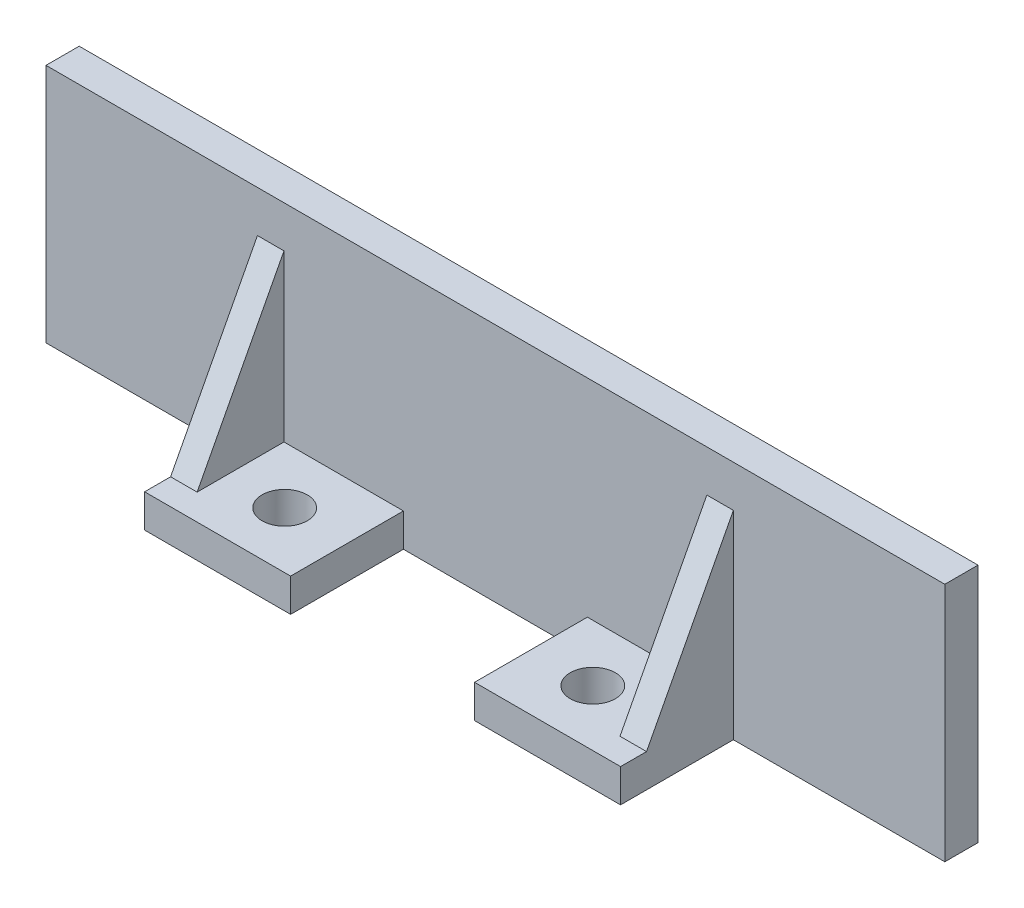
ISO-10303-21;
HEADER;
FILE_DESCRIPTION(('STEP AP214'),'2;1');
FILE_NAME('part.step','',(''),(''),'','','');
FILE_SCHEMA(('AUTOMOTIVE_DESIGN { 1 0 10303 214 1 1 1 1 }'));
ENDSEC;
DATA;
#1=APPLICATION_CONTEXT('core data for automotive mechanical design processes');
#2=APPLICATION_PROTOCOL_DEFINITION('international standard','automotive_design',2000,#1);
#3=PRODUCT_CONTEXT('',#1,'mechanical');
#4=PRODUCT('Part','Part','',(#3));
#5=PRODUCT_RELATED_PRODUCT_CATEGORY('part','',(#4));
#6=PRODUCT_DEFINITION_FORMATION('','',#4);
#7=PRODUCT_DEFINITION_CONTEXT('part definition',#1,'design');
#8=PRODUCT_DEFINITION('design','',#6,#7);
#9=PRODUCT_DEFINITION_SHAPE('','',#8);
#10=(LENGTH_UNIT() NAMED_UNIT(*) SI_UNIT(.MILLI.,.METRE.));
#11=(NAMED_UNIT(*) PLANE_ANGLE_UNIT() SI_UNIT($,.RADIAN.));
#12=(NAMED_UNIT(*) SI_UNIT($,.STERADIAN.) SOLID_ANGLE_UNIT());
#13=UNCERTAINTY_MEASURE_WITH_UNIT(LENGTH_MEASURE(1.E-05),#10,'distance_accuracy_value','');
#14=(GEOMETRIC_REPRESENTATION_CONTEXT(3) GLOBAL_UNCERTAINTY_ASSIGNED_CONTEXT((#13)) GLOBAL_UNIT_ASSIGNED_CONTEXT((#10,
#11,#12)) REPRESENTATION_CONTEXT('',''));
#15=CARTESIAN_POINT('',(0.,0.,0.));
#16=DIRECTION('',(0.,0.,1.));
#17=DIRECTION('',(1.,0.,0.));
#18=AXIS2_PLACEMENT_3D('',#15,#16,#17);
#19=CARTESIAN_POINT('',(-43.,-11.5,-3.175));
#20=DIRECTION('',(0.,-1.,0.));
#21=DIRECTION('',(0.,0.,-1.));
#22=AXIS2_PLACEMENT_3D('',#19,#20,#21);
#23=PLANE('',#22);
#24=CARTESIAN_POINT('',(14.7428170399997,-11.5,5.42176077798989));
#25=DIRECTION('',(0.,-1.,0.));
#26=DIRECTION('',(0.,0.,-1.));
#27=AXIS2_PLACEMENT_3D('',#24,#25,#26);
#28=CIRCLE('',#27,2.159);
#29=CARTESIAN_POINT('',(14.7428170399997,-11.5,3.26276077798989));
#30=VERTEX_POINT('',#29);
#31=EDGE_CURVE('E321',#30,#30,#28,.F.);
#32=ORIENTED_EDGE('',*,*,#31,.T.);
#33=EDGE_LOOP('',(#32));
#34=FACE_BOUND('',#33,.T.);
#35=CARTESIAN_POINT('',(-14.7428170399997,-11.5,5.42176077798989));
#36=DIRECTION('',(0.,-1.,0.));
#37=DIRECTION('',(0.,0.,-1.));
#38=AXIS2_PLACEMENT_3D('',#35,#36,#37);
#39=CIRCLE('',#38,2.159);
#40=CARTESIAN_POINT('',(-14.7428170399997,-11.5,3.26276077798989));
#41=VERTEX_POINT('',#40);
#42=EDGE_CURVE('E320',#41,#41,#39,.T.);
#43=ORIENTED_EDGE('',*,*,#42,.F.);
#44=EDGE_LOOP('',(#43));
#45=FACE_BOUND('',#44,.T.);
#46=DIRECTION('',(1.,0.,0.));
#47=VECTOR('',#46,1.);
#48=CARTESIAN_POINT('',(-43.,-11.5,0.));
#49=LINE('',#48,#47);
#50=CARTESIAN_POINT('',(22.7700000105,-11.5,0.));
#51=VERTEX_POINT('',#50);
#52=CARTESIAN_POINT('',(43.,-11.5,0.));
#53=VERTEX_POINT('',#52);
#54=EDGE_CURVE('E153',#51,#53,#49,.T.);
#55=ORIENTED_EDGE('',*,*,#54,.F.);
#56=DIRECTION('',(0.,0.,1.));
#57=VECTOR('',#56,1.);
#58=CARTESIAN_POINT('',(22.7700000105,-11.5,-3.175));
#59=LINE('',#58,#57);
#60=CARTESIAN_POINT('',(22.7700000105,-11.5,10.795));
#61=VERTEX_POINT('',#60);
#62=EDGE_CURVE('E155',#51,#61,#59,.T.);
#63=ORIENTED_EDGE('',*,*,#62,.T.);
#64=DIRECTION('',(-1.,0.,0.));
#65=VECTOR('',#64,1.);
#66=CARTESIAN_POINT('',(34.2000000105,-11.5,10.795));
#67=LINE('',#66,#65);
#68=CARTESIAN_POINT('',(8.80000001049999,-11.5,10.795));
#69=VERTEX_POINT('',#68);
#70=EDGE_CURVE('E220',#61,#69,#67,.T.);
#71=ORIENTED_EDGE('',*,*,#70,.T.);
#72=DIRECTION('',(0.,0.,-1.));
#73=VECTOR('',#72,1.);
#74=CARTESIAN_POINT('',(8.80000001049999,-11.5,10.795));
#75=LINE('',#74,#73);
#76=CARTESIAN_POINT('',(8.8000000105,-11.5,0.));
#77=VERTEX_POINT('',#76);
#78=EDGE_CURVE('E225',#69,#77,#75,.T.);
#79=ORIENTED_EDGE('',*,*,#78,.T.);
#80=CARTESIAN_POINT('',(-8.80000001050001,-11.5,0.));
#81=VERTEX_POINT('',#80);
#82=EDGE_CURVE('E162',#81,#77,#49,.T.);
#83=ORIENTED_EDGE('',*,*,#82,.F.);
#84=DIRECTION('',(0.,0.,1.));
#85=VECTOR('',#84,1.);
#86=CARTESIAN_POINT('',(-8.8000000105,-11.5,10.795));
#87=LINE('',#86,#85);
#88=CARTESIAN_POINT('',(-8.8000000105,-11.5,10.795));
#89=VERTEX_POINT('',#88);
#90=EDGE_CURVE('E242',#81,#89,#87,.T.);
#91=ORIENTED_EDGE('',*,*,#90,.T.);
#92=DIRECTION('',(-1.,0.,0.));
#93=VECTOR('',#92,1.);
#94=CARTESIAN_POINT('',(-34.2000000105,-11.5,10.795));
#95=LINE('',#94,#93);
#96=CARTESIAN_POINT('',(-22.7700000105,-11.5,10.795));
#97=VERTEX_POINT('',#96);
#98=EDGE_CURVE('E250',#89,#97,#95,.T.);
#99=ORIENTED_EDGE('',*,*,#98,.T.);
#100=DIRECTION('',(0.,0.,1.));
#101=VECTOR('',#100,1.);
#102=CARTESIAN_POINT('',(-22.7700000105,-11.5,-3.175));
#103=LINE('',#102,#101);
#104=CARTESIAN_POINT('',(-22.7700000105,-11.5,0.));
#105=VERTEX_POINT('',#104);
#106=EDGE_CURVE('E189',#105,#97,#103,.T.);
#107=ORIENTED_EDGE('',*,*,#106,.F.);
#108=CARTESIAN_POINT('',(-43.,-11.5,0.));
#109=VERTEX_POINT('',#108);
#110=EDGE_CURVE('E165',#109,#105,#49,.T.);
#111=ORIENTED_EDGE('',*,*,#110,.F.);
#112=DIRECTION('',(0.,0.,1.));
#113=VECTOR('',#112,1.);
#114=CARTESIAN_POINT('',(-43.,-11.5,-3.175));
#115=LINE('',#114,#113);
#116=CARTESIAN_POINT('',(-43.,-11.5,-3.175));
#117=VERTEX_POINT('',#116);
#118=EDGE_CURVE('E295',#117,#109,#115,.T.);
#119=ORIENTED_EDGE('',*,*,#118,.F.);
#120=DIRECTION('',(1.,0.,0.));
#121=VECTOR('',#120,1.);
#122=CARTESIAN_POINT('',(-43.,-11.5,-3.175));
#123=LINE('',#122,#121);
#124=CARTESIAN_POINT('',(43.,-11.5,-3.175));
#125=VERTEX_POINT('',#124);
#126=EDGE_CURVE('E270',#117,#125,#123,.T.);
#127=ORIENTED_EDGE('',*,*,#126,.T.);
#128=DIRECTION('',(0.,0.,1.));
#129=VECTOR('',#128,1.);
#130=CARTESIAN_POINT('',(43.,-11.5,-3.175));
#131=LINE('',#130,#129);
#132=EDGE_CURVE('E158',#125,#53,#131,.T.);
#133=ORIENTED_EDGE('',*,*,#132,.T.);
#134=EDGE_LOOP('',(#55,#63,#71,#79,#83,#91,#99,#107,#111,#119,#127,#133));
#135=FACE_BOUND('',#134,.T.);
#136=ADVANCED_FACE('F39',(#34,#45,#135),#23,.T.);
#137=CARTESIAN_POINT('',(34.2000000105,-8.325,10.795));
#138=DIRECTION('',(0.,0.,1.));
#139=DIRECTION('',(1.,0.,0.));
#140=AXIS2_PLACEMENT_3D('',#137,#138,#139);
#141=PLANE('',#140);
#142=ORIENTED_EDGE('',*,*,#70,.F.);
#143=DIRECTION('',(0.,1.,0.));
#144=VECTOR('',#143,1.);
#145=CARTESIAN_POINT('',(22.7700000105001,-115.5,10.795));
#146=LINE('',#145,#144);
#147=CARTESIAN_POINT('',(22.7700000105,-8.325,10.795));
#148=VERTEX_POINT('',#147);
#149=EDGE_CURVE('E175',#61,#148,#146,.T.);
#150=ORIENTED_EDGE('',*,*,#149,.T.);
#151=DIRECTION('',(-1.,0.,0.));
#152=VECTOR('',#151,1.);
#153=CARTESIAN_POINT('',(34.2000000105,-8.325,10.795));
#154=LINE('',#153,#152);
#155=CARTESIAN_POINT('',(8.80000001049999,-8.325,10.795));
#156=VERTEX_POINT('',#155);
#157=EDGE_CURVE('E224',#148,#156,#154,.T.);
#158=ORIENTED_EDGE('',*,*,#157,.T.);
#159=DIRECTION('',(0.,-1.,0.));
#160=VECTOR('',#159,1.);
#161=CARTESIAN_POINT('',(8.80000001049999,-8.325,10.795));
#162=LINE('',#161,#160);
#163=EDGE_CURVE('E232',#156,#69,#162,.T.);
#164=ORIENTED_EDGE('',*,*,#163,.T.);
#165=EDGE_LOOP('',(#142,#150,#158,#164));
#166=FACE_BOUND('',#165,.T.);
#167=ADVANCED_FACE('F337',(#166),#141,.T.);
#168=CARTESIAN_POINT('',(0.,-8.325,0.));
#169=DIRECTION('',(0.,-1.,0.));
#170=DIRECTION('',(0.,0.,-1.));
#171=AXIS2_PLACEMENT_3D('',#168,#169,#170);
#172=PLANE('',#171);
#173=CARTESIAN_POINT('',(14.7428170399997,-8.325,5.42176077798989));
#174=DIRECTION('',(0.,-1.,0.));
#175=DIRECTION('',(0.,0.,-1.));
#176=AXIS2_PLACEMENT_3D('',#173,#174,#175);
#177=CIRCLE('',#176,2.159);
#178=CARTESIAN_POINT('',(14.7428170399997,-8.325,3.26276077798989));
#179=VERTEX_POINT('',#178);
#180=EDGE_CURVE('E42',#179,#179,#177,.F.);
#181=ORIENTED_EDGE('',*,*,#180,.F.);
#182=EDGE_LOOP('',(#181));
#183=FACE_BOUND('',#182,.T.);
#184=DIRECTION('',(0.,0.,1.));
#185=VECTOR('',#184,1.);
#186=CARTESIAN_POINT('',(22.7700000105,-8.325,0.));
#187=LINE('',#186,#185);
#188=CARTESIAN_POINT('',(22.7700000105,-8.325,8.30928121078587));
#189=VERTEX_POINT('',#188);
#190=EDGE_CURVE('E178',#189,#148,#187,.T.);
#191=ORIENTED_EDGE('',*,*,#190,.F.);
#192=DIRECTION('',(-1.,0.,0.));
#193=VECTOR('',#192,1.);
#194=CARTESIAN_POINT('',(0.,-8.325,8.30928121078585));
#195=LINE('',#194,#193);
#196=CARTESIAN_POINT('',(20.2300000105,-8.325,8.30928121078586));
#197=VERTEX_POINT('',#196);
#198=EDGE_CURVE('E11',#189,#197,#195,.T.);
#199=ORIENTED_EDGE('',*,*,#198,.T.);
#200=DIRECTION('',(0.,0.,1.));
#201=VECTOR('',#200,1.);
#202=CARTESIAN_POINT('',(20.2300000105,-8.325,0.));
#203=LINE('',#202,#201);
#204=CARTESIAN_POINT('',(20.2300000105,-8.325,0.));
#205=VERTEX_POINT('',#204);
#206=EDGE_CURVE('E48',#205,#197,#203,.T.);
#207=ORIENTED_EDGE('',*,*,#206,.F.);
#208=DIRECTION('',(1.,0.,0.));
#209=VECTOR('',#208,1.);
#210=CARTESIAN_POINT('',(34.2000000105,-8.325,0.));
#211=LINE('',#210,#209);
#212=CARTESIAN_POINT('',(8.80000001049999,-8.325,0.));
#213=VERTEX_POINT('',#212);
#214=EDGE_CURVE('E221',#213,#205,#211,.T.);
#215=ORIENTED_EDGE('',*,*,#214,.F.);
#216=DIRECTION('',(0.,0.,-1.));
#217=VECTOR('',#216,1.);
#218=CARTESIAN_POINT('',(8.80000001049999,-8.325,10.795));
#219=LINE('',#218,#217);
#220=EDGE_CURVE('E228',#156,#213,#219,.T.);
#221=ORIENTED_EDGE('',*,*,#220,.F.);
#222=ORIENTED_EDGE('',*,*,#157,.F.);
#223=EDGE_LOOP('',(#191,#199,#207,#215,#221,#222));
#224=FACE_BOUND('',#223,.T.);
#225=ADVANCED_FACE('F341',(#183,#224),#172,.F.);
#226=CARTESIAN_POINT('',(0.,0.,0.));
#227=DIRECTION('',(0.,0.,-1.));
#228=DIRECTION('',(-1.,0.,0.));
#229=AXIS2_PLACEMENT_3D('',#226,#227,#228);
#230=PLANE('',#229);
#231=DIRECTION('',(0.,-1.,0.));
#232=VECTOR('',#231,1.);
#233=CARTESIAN_POINT('',(43.,11.5,0.));
#234=LINE('',#233,#232);
#235=CARTESIAN_POINT('',(43.,11.5,0.));
#236=VERTEX_POINT('',#235);
#237=EDGE_CURVE('E286',#236,#53,#234,.T.);
#238=ORIENTED_EDGE('',*,*,#237,.F.);
#239=DIRECTION('',(1.,0.,0.));
#240=VECTOR('',#239,1.);
#241=CARTESIAN_POINT('',(-43.,11.5,0.));
#242=LINE('',#241,#240);
#243=CARTESIAN_POINT('',(-43.,11.5,0.));
#244=VERTEX_POINT('',#243);
#245=EDGE_CURVE('E289',#244,#236,#242,.T.);
#246=ORIENTED_EDGE('',*,*,#245,.F.);
#247=DIRECTION('',(0.,-1.,0.));
#248=VECTOR('',#247,1.);
#249=CARTESIAN_POINT('',(-43.,11.5,0.));
#250=LINE('',#249,#248);
#251=EDGE_CURVE('E274',#244,#109,#250,.T.);
#252=ORIENTED_EDGE('',*,*,#251,.T.);
#253=ORIENTED_EDGE('',*,*,#110,.T.);
#254=DIRECTION('',(0.,1.,0.));
#255=VECTOR('',#254,1.);
#256=CARTESIAN_POINT('',(-22.7700000105,0.,0.));
#257=LINE('',#256,#255);
#258=CARTESIAN_POINT('',(-22.7700000105,7.5106208252376,0.));
#259=VERTEX_POINT('',#258);
#260=EDGE_CURVE('E213',#105,#259,#257,.T.);
#261=ORIENTED_EDGE('',*,*,#260,.T.);
#262=DIRECTION('',(-1.,0.,0.));
#263=VECTOR('',#262,1.);
#264=CARTESIAN_POINT('',(0.,7.5106208252376,0.));
#265=LINE('',#264,#263);
#266=CARTESIAN_POINT('',(-20.2300000105,7.5106208252376,0.));
#267=VERTEX_POINT('',#266);
#268=EDGE_CURVE('E216',#259,#267,#265,.F.);
#269=ORIENTED_EDGE('',*,*,#268,.T.);
#270=DIRECTION('',(0.,1.,0.));
#271=VECTOR('',#270,1.);
#272=CARTESIAN_POINT('',(-20.2300000105,0.,0.));
#273=LINE('',#272,#271);
#274=CARTESIAN_POINT('',(-20.2300000105,-8.325,0.));
#275=VERTEX_POINT('',#274);
#276=EDGE_CURVE('E208',#275,#267,#273,.T.);
#277=ORIENTED_EDGE('',*,*,#276,.F.);
#278=DIRECTION('',(1.,0.,0.));
#279=VECTOR('',#278,1.);
#280=CARTESIAN_POINT('',(-34.2000000105,-8.325,0.));
#281=LINE('',#280,#279);
#282=CARTESIAN_POINT('',(-8.80000001050001,-8.325,0.));
#283=VERTEX_POINT('',#282);
#284=EDGE_CURVE('E246',#275,#283,#281,.T.);
#285=ORIENTED_EDGE('',*,*,#284,.T.);
#286=DIRECTION('',(0.,-1.,0.));
#287=VECTOR('',#286,1.);
#288=CARTESIAN_POINT('',(-8.80000001050001,-8.325,0.));
#289=LINE('',#288,#287);
#290=EDGE_CURVE('E258',#283,#81,#289,.T.);
#291=ORIENTED_EDGE('',*,*,#290,.T.);
#292=ORIENTED_EDGE('',*,*,#82,.T.);
#293=DIRECTION('',(0.,-1.,0.));
#294=VECTOR('',#293,1.);
#295=CARTESIAN_POINT('',(8.80000001050001,-8.325,0.));
#296=LINE('',#295,#294);
#297=EDGE_CURVE('E238',#213,#77,#296,.T.);
#298=ORIENTED_EDGE('',*,*,#297,.F.);
#299=ORIENTED_EDGE('',*,*,#214,.T.);
#300=DIRECTION('',(0.,-1.,0.));
#301=VECTOR('',#300,1.);
#302=CARTESIAN_POINT('',(20.2300000105,0.,0.));
#303=LINE('',#302,#301);
#304=CARTESIAN_POINT('',(20.2300000105,7.51062082523762,0.));
#305=VERTEX_POINT('',#304);
#306=EDGE_CURVE('E61',#305,#205,#303,.T.);
#307=ORIENTED_EDGE('',*,*,#306,.F.);
#308=DIRECTION('',(1.,0.,0.));
#309=VECTOR('',#308,1.);
#310=CARTESIAN_POINT('',(0.,7.5106208252376,0.));
#311=LINE('',#310,#309);
#312=CARTESIAN_POINT('',(22.7700000105,7.51062082523762,0.));
#313=VERTEX_POINT('',#312);
#314=EDGE_CURVE('E56',#305,#313,#311,.T.);
#315=ORIENTED_EDGE('',*,*,#314,.T.);
#316=DIRECTION('',(0.,-1.,0.));
#317=VECTOR('',#316,1.);
#318=CARTESIAN_POINT('',(22.7700000105,0.,0.));
#319=LINE('',#318,#317);
#320=EDGE_CURVE('E166',#313,#51,#319,.T.);
#321=ORIENTED_EDGE('',*,*,#320,.T.);
#322=ORIENTED_EDGE('',*,*,#54,.T.);
#323=EDGE_LOOP('',(#238,#246,#252,#253,#261,#269,#277,#285,#291,#292,#298,#299,#307,#315,#321,#322));
#324=FACE_BOUND('',#323,.T.);
#325=ADVANCED_FACE('F167',(#324),#230,.F.);
#326=CARTESIAN_POINT('',(-43.,11.5,-3.175));
#327=DIRECTION('',(-1.,0.,0.));
#328=DIRECTION('',(0.,-1.,0.));
#329=AXIS2_PLACEMENT_3D('',#326,#327,#328);
#330=PLANE('',#329);
#331=ORIENTED_EDGE('',*,*,#251,.F.);
#332=DIRECTION('',(0.,0.,1.));
#333=VECTOR('',#332,1.);
#334=CARTESIAN_POINT('',(-43.,11.5,-3.175));
#335=LINE('',#334,#333);
#336=CARTESIAN_POINT('',(-43.,11.5,-3.175));
#337=VERTEX_POINT('',#336);
#338=EDGE_CURVE('E299',#337,#244,#335,.T.);
#339=ORIENTED_EDGE('',*,*,#338,.F.);
#340=DIRECTION('',(0.,-1.,0.));
#341=VECTOR('',#340,1.);
#342=CARTESIAN_POINT('',(-43.,11.5,-3.175));
#343=LINE('',#342,#341);
#344=EDGE_CURVE('E281',#337,#117,#343,.T.);
#345=ORIENTED_EDGE('',*,*,#344,.T.);
#346=ORIENTED_EDGE('',*,*,#118,.T.);
#347=EDGE_LOOP('',(#331,#339,#345,#346));
#348=FACE_BOUND('',#347,.T.);
#349=ADVANCED_FACE('F471',(#348),#330,.T.);
#350=CARTESIAN_POINT('',(-43.,11.5,-3.175));
#351=DIRECTION('',(0.,-1.,0.));
#352=DIRECTION('',(0.,0.,-1.));
#353=AXIS2_PLACEMENT_3D('',#350,#351,#352);
#354=PLANE('',#353);
#355=DIRECTION('',(0.,0.,1.));
#356=VECTOR('',#355,1.);
#357=CARTESIAN_POINT('',(43.,11.5,-3.175));
#358=LINE('',#357,#356);
#359=CARTESIAN_POINT('',(43.,11.5,-3.175));
#360=VERTEX_POINT('',#359);
#361=EDGE_CURVE('E302',#360,#236,#358,.T.);
#362=ORIENTED_EDGE('',*,*,#361,.F.);
#363=DIRECTION('',(1.,0.,0.));
#364=VECTOR('',#363,1.);
#365=CARTESIAN_POINT('',(-43.,11.5,-3.175));
#366=LINE('',#365,#364);
#367=EDGE_CURVE('E278',#337,#360,#366,.T.);
#368=ORIENTED_EDGE('',*,*,#367,.F.);
#369=ORIENTED_EDGE('',*,*,#338,.T.);
#370=ORIENTED_EDGE('',*,*,#245,.T.);
#371=EDGE_LOOP('',(#362,#368,#369,#370));
#372=FACE_BOUND('',#371,.T.);
#373=ADVANCED_FACE('F478',(#372),#354,.F.);
#374=CARTESIAN_POINT('',(43.,11.5,-3.175));
#375=DIRECTION('',(-1.,0.,0.));
#376=DIRECTION('',(0.,-1.,0.));
#377=AXIS2_PLACEMENT_3D('',#374,#375,#376);
#378=PLANE('',#377);
#379=ORIENTED_EDGE('',*,*,#237,.T.);
#380=ORIENTED_EDGE('',*,*,#132,.F.);
#381=DIRECTION('',(0.,-1.,0.));
#382=VECTOR('',#381,1.);
#383=CARTESIAN_POINT('',(43.,11.5,-3.175));
#384=LINE('',#383,#382);
#385=EDGE_CURVE('E273',#360,#125,#384,.T.);
#386=ORIENTED_EDGE('',*,*,#385,.F.);
#387=ORIENTED_EDGE('',*,*,#361,.T.);
#388=EDGE_LOOP('',(#379,#380,#386,#387));
#389=FACE_BOUND('',#388,.T.);
#390=ADVANCED_FACE('F482',(#389),#378,.F.);
#391=CARTESIAN_POINT('',(0.,0.,-3.175));
#392=DIRECTION('',(0.,0.,-1.));
#393=DIRECTION('',(-1.,0.,0.));
#394=AXIS2_PLACEMENT_3D('',#391,#392,#393);
#395=PLANE('',#394);
#396=ORIENTED_EDGE('',*,*,#385,.T.);
#397=ORIENTED_EDGE('',*,*,#126,.F.);
#398=ORIENTED_EDGE('',*,*,#344,.F.);
#399=ORIENTED_EDGE('',*,*,#367,.T.);
#400=EDGE_LOOP('',(#396,#397,#398,#399));
#401=FACE_BOUND('',#400,.T.);
#402=ADVANCED_FACE('F427',(#401),#395,.T.);
#403=CARTESIAN_POINT('',(-34.2000000105,-8.325,10.795));
#404=DIRECTION('',(0.,0.,1.));
#405=DIRECTION('',(1.,0.,0.));
#406=AXIS2_PLACEMENT_3D('',#403,#404,#405);
#407=PLANE('',#406);
#408=DIRECTION('',(0.,1.,0.));
#409=VECTOR('',#408,1.);
#410=CARTESIAN_POINT('',(-22.7700000105,-115.5,10.795));
#411=LINE('',#410,#409);
#412=CARTESIAN_POINT('',(-22.7700000105,-8.325,10.795));
#413=VERTEX_POINT('',#412);
#414=EDGE_CURVE('E177',#97,#413,#411,.T.);
#415=ORIENTED_EDGE('',*,*,#414,.F.);
#416=ORIENTED_EDGE('',*,*,#98,.F.);
#417=DIRECTION('',(0.,-1.,0.));
#418=VECTOR('',#417,1.);
#419=CARTESIAN_POINT('',(-8.8000000105,-8.325,10.795));
#420=LINE('',#419,#418);
#421=CARTESIAN_POINT('',(-8.8000000105,-8.325,10.795));
#422=VERTEX_POINT('',#421);
#423=EDGE_CURVE('E163',#422,#89,#420,.T.);
#424=ORIENTED_EDGE('',*,*,#423,.F.);
#425=DIRECTION('',(-1.,0.,0.));
#426=VECTOR('',#425,1.);
#427=CARTESIAN_POINT('',(-34.2000000105,-8.325,10.795));
#428=LINE('',#427,#426);
#429=EDGE_CURVE('E254',#422,#413,#428,.T.);
#430=ORIENTED_EDGE('',*,*,#429,.T.);
#431=EDGE_LOOP('',(#415,#416,#424,#430));
#432=FACE_BOUND('',#431,.T.);
#433=ADVANCED_FACE('F362',(#432),#407,.T.);
#434=CARTESIAN_POINT('',(-8.8000000105,-8.325,10.795));
#435=DIRECTION('',(1.,0.,0.));
#436=DIRECTION('',(0.,0.,-1.));
#437=AXIS2_PLACEMENT_3D('',#434,#435,#436);
#438=PLANE('',#437);
#439=ORIENTED_EDGE('',*,*,#90,.F.);
#440=ORIENTED_EDGE('',*,*,#290,.F.);
#441=DIRECTION('',(0.,0.,1.));
#442=VECTOR('',#441,1.);
#443=CARTESIAN_POINT('',(-8.8000000105,-8.325,10.795));
#444=LINE('',#443,#442);
#445=EDGE_CURVE('E249',#283,#422,#444,.T.);
#446=ORIENTED_EDGE('',*,*,#445,.T.);
#447=ORIENTED_EDGE('',*,*,#423,.T.);
#448=EDGE_LOOP('',(#439,#440,#446,#447));
#449=FACE_BOUND('',#448,.T.);
#450=ADVANCED_FACE('F354',(#449),#438,.T.);
#451=CARTESIAN_POINT('',(0.,-8.325,0.));
#452=DIRECTION('',(0.,1.,0.));
#453=DIRECTION('',(0.,0.,1.));
#454=AXIS2_PLACEMENT_3D('',#451,#452,#453);
#455=PLANE('',#454);
#456=CARTESIAN_POINT('',(-14.7428170399997,-8.325,5.42176077798989));
#457=DIRECTION('',(0.,1.,0.));
#458=DIRECTION('',(0.,0.,1.));
#459=AXIS2_PLACEMENT_3D('',#456,#457,#458);
#460=CIRCLE('',#459,2.159);
#461=CARTESIAN_POINT('',(-14.7428170399997,-8.325,7.58076077798988));
#462=VERTEX_POINT('',#461);
#463=EDGE_CURVE('E317',#462,#462,#460,.T.);
#464=ORIENTED_EDGE('',*,*,#463,.F.);
#465=EDGE_LOOP('',(#464));
#466=FACE_BOUND('',#465,.T.);
#467=DIRECTION('',(0.,0.,-1.));
#468=VECTOR('',#467,1.);
#469=CARTESIAN_POINT('',(-22.7700000105,-8.325,0.));
#470=LINE('',#469,#468);
#471=CARTESIAN_POINT('',(-22.7700000105,-8.325,8.30928121078586));
#472=VERTEX_POINT('',#471);
#473=EDGE_CURVE('E182',#413,#472,#470,.T.);
#474=ORIENTED_EDGE('',*,*,#473,.F.);
#475=ORIENTED_EDGE('',*,*,#429,.F.);
#476=ORIENTED_EDGE('',*,*,#445,.F.);
#477=ORIENTED_EDGE('',*,*,#284,.F.);
#478=DIRECTION('',(0.,0.,1.));
#479=VECTOR('',#478,1.);
#480=CARTESIAN_POINT('',(-20.2300000105,-8.325,0.));
#481=LINE('',#480,#479);
#482=CARTESIAN_POINT('',(-20.2300000105,-8.325,8.30928121078586));
#483=VERTEX_POINT('',#482);
#484=EDGE_CURVE('E298',#275,#483,#481,.T.);
#485=ORIENTED_EDGE('',*,*,#484,.T.);
#486=DIRECTION('',(-1.,0.,0.));
#487=VECTOR('',#486,1.);
#488=CARTESIAN_POINT('',(0.,-8.325,8.30928121078585));
#489=LINE('',#488,#487);
#490=EDGE_CURVE('E311',#472,#483,#489,.F.);
#491=ORIENTED_EDGE('',*,*,#490,.F.);
#492=EDGE_LOOP('',(#474,#475,#476,#477,#485,#491));
#493=FACE_BOUND('',#492,.T.);
#494=ADVANCED_FACE('F358',(#466,#493),#455,.T.);
#495=CARTESIAN_POINT('',(8.80000001049999,-8.325,10.795));
#496=DIRECTION('',(-1.,0.,0.));
#497=DIRECTION('',(0.,0.,1.));
#498=AXIS2_PLACEMENT_3D('',#495,#496,#497);
#499=PLANE('',#498);
#500=ORIENTED_EDGE('',*,*,#78,.F.);
#501=ORIENTED_EDGE('',*,*,#163,.F.);
#502=ORIENTED_EDGE('',*,*,#220,.T.);
#503=ORIENTED_EDGE('',*,*,#297,.T.);
#504=EDGE_LOOP('',(#500,#501,#502,#503));
#505=FACE_BOUND('',#504,.T.);
#506=ADVANCED_FACE('F346',(#505),#499,.T.);
#507=CARTESIAN_POINT('',(-21.5000000105,7.5106208252376,0.));
#508=DIRECTION('',(0.,-0.464640145204905,-0.885499596535179));
#509=DIRECTION('',(0.,-0.885499596535179,0.464640145204905));
#510=AXIS2_PLACEMENT_3D('',#507,#508,#509);
#511=PLANE('',#510);
#512=ORIENTED_EDGE('',*,*,#268,.F.);
#513=DIRECTION('',(0.,-0.885499596535179,0.464640145204905));
#514=VECTOR('',#513,1.);
#515=CARTESIAN_POINT('',(-22.7700000105,7.5106208252376,0.));
#516=LINE('',#515,#514);
#517=EDGE_CURVE('E204',#259,#472,#516,.T.);
#518=ORIENTED_EDGE('',*,*,#517,.T.);
#519=ORIENTED_EDGE('',*,*,#490,.T.);
#520=DIRECTION('',(0.,-0.885499596535179,0.464640145204905));
#521=VECTOR('',#520,1.);
#522=CARTESIAN_POINT('',(-20.2300000105,7.5106208252376,0.));
#523=LINE('',#522,#521);
#524=EDGE_CURVE('E203',#267,#483,#523,.T.);
#525=ORIENTED_EDGE('',*,*,#524,.F.);
#526=EDGE_LOOP('',(#512,#518,#519,#525));
#527=FACE_BOUND('',#526,.T.);
#528=ADVANCED_FACE('F373',(#527),#511,.F.);
#529=CARTESIAN_POINT('',(-22.7700000105,0.,3.81));
#530=DIRECTION('',(-1.,0.,0.));
#531=DIRECTION('',(0.,-1.,0.));
#532=AXIS2_PLACEMENT_3D('',#529,#530,#531);
#533=PLANE('',#532);
#534=ORIENTED_EDGE('',*,*,#517,.F.);
#535=ORIENTED_EDGE('',*,*,#260,.F.);
#536=ORIENTED_EDGE('',*,*,#106,.T.);
#537=ORIENTED_EDGE('',*,*,#414,.T.);
#538=ORIENTED_EDGE('',*,*,#473,.T.);
#539=EDGE_LOOP('',(#534,#535,#536,#537,#538));
#540=FACE_BOUND('',#539,.T.);
#541=ADVANCED_FACE('F369',(#540),#533,.T.);
#542=CARTESIAN_POINT('',(-20.2300000105,0.,3.81));
#543=DIRECTION('',(-1.,0.,0.));
#544=DIRECTION('',(0.,-1.,0.));
#545=AXIS2_PLACEMENT_3D('',#542,#543,#544);
#546=PLANE('',#545);
#547=ORIENTED_EDGE('',*,*,#484,.F.);
#548=ORIENTED_EDGE('',*,*,#276,.T.);
#549=ORIENTED_EDGE('',*,*,#524,.T.);
#550=EDGE_LOOP('',(#547,#548,#549));
#551=FACE_BOUND('',#550,.T.);
#552=ADVANCED_FACE('F375',(#551),#546,.F.);
#553=CARTESIAN_POINT('',(21.5000000105,7.51062082523762,0.));
#554=DIRECTION('',(0.,0.464640145204905,0.885499596535179));
#555=DIRECTION('',(0.,-0.885499596535179,0.464640145204905));
#556=AXIS2_PLACEMENT_3D('',#553,#554,#555);
#557=PLANE('',#556);
#558=ORIENTED_EDGE('',*,*,#314,.F.);
#559=DIRECTION('',(0.,-0.885499596535179,0.464640145204905));
#560=VECTOR('',#559,1.);
#561=CARTESIAN_POINT('',(20.2300000105,7.51062082523762,0.));
#562=LINE('',#561,#560);
#563=EDGE_CURVE('E192',#305,#197,#562,.T.);
#564=ORIENTED_EDGE('',*,*,#563,.T.);
#565=ORIENTED_EDGE('',*,*,#198,.F.);
#566=DIRECTION('',(0.,-0.885499596535179,0.464640145204905));
#567=VECTOR('',#566,1.);
#568=CARTESIAN_POINT('',(22.7700000105,7.51062082523762,0.));
#569=LINE('',#568,#567);
#570=EDGE_CURVE('E193',#313,#189,#569,.T.);
#571=ORIENTED_EDGE('',*,*,#570,.F.);
#572=EDGE_LOOP('',(#558,#564,#565,#571));
#573=FACE_BOUND('',#572,.T.);
#574=ADVANCED_FACE('F377',(#573),#557,.T.);
#575=CARTESIAN_POINT('',(22.7700000105,0.,3.81));
#576=DIRECTION('',(1.,0.,0.));
#577=DIRECTION('',(0.,1.,0.));
#578=AXIS2_PLACEMENT_3D('',#575,#576,#577);
#579=PLANE('',#578);
#580=ORIENTED_EDGE('',*,*,#570,.T.);
#581=ORIENTED_EDGE('',*,*,#190,.T.);
#582=ORIENTED_EDGE('',*,*,#149,.F.);
#583=ORIENTED_EDGE('',*,*,#62,.F.);
#584=ORIENTED_EDGE('',*,*,#320,.F.);
#585=EDGE_LOOP('',(#580,#581,#582,#583,#584));
#586=FACE_BOUND('',#585,.T.);
#587=ADVANCED_FACE('F173',(#586),#579,.T.);
#588=CARTESIAN_POINT('',(20.2300000105,0.,3.81));
#589=DIRECTION('',(1.,0.,0.));
#590=DIRECTION('',(0.,1.,0.));
#591=AXIS2_PLACEMENT_3D('',#588,#589,#590);
#592=PLANE('',#591);
#593=ORIENTED_EDGE('',*,*,#563,.F.);
#594=ORIENTED_EDGE('',*,*,#306,.T.);
#595=ORIENTED_EDGE('',*,*,#206,.T.);
#596=EDGE_LOOP('',(#593,#594,#595));
#597=FACE_BOUND('',#596,.T.);
#598=ADVANCED_FACE('F398',(#597),#592,.F.);
#599=CARTESIAN_POINT('',(-14.7428170399997,-115.5,5.42176077798989));
#600=DIRECTION('',(0.,1.,0.));
#601=DIRECTION('',(0.,0.,1.));
#602=AXIS2_PLACEMENT_3D('',#599,#600,#601);
#603=CYLINDRICAL_SURFACE('',#602,2.159);
#604=ORIENTED_EDGE('',*,*,#42,.T.);
#605=EDGE_LOOP('',(#604));
#606=FACE_BOUND('',#605,.T.);
#607=ORIENTED_EDGE('',*,*,#463,.T.);
#608=EDGE_LOOP('',(#607));
#609=FACE_BOUND('',#608,.T.);
#610=ADVANCED_FACE('F395',(#606,#609),#603,.F.);
#611=CARTESIAN_POINT('',(14.7428170399997,-115.5,5.42176077798989));
#612=DIRECTION('',(0.,1.,0.));
#613=DIRECTION('',(-1.,0.,0.));
#614=AXIS2_PLACEMENT_3D('',#611,#612,#613);
#615=CYLINDRICAL_SURFACE('',#614,2.159);
#616=ORIENTED_EDGE('',*,*,#31,.F.);
#617=EDGE_LOOP('',(#616));
#618=FACE_BOUND('',#617,.T.);
#619=ORIENTED_EDGE('',*,*,#180,.T.);
#620=EDGE_LOOP('',(#619));
#621=FACE_BOUND('',#620,.T.);
#622=ADVANCED_FACE('F397',(#618,#621),#615,.F.);
#623=CLOSED_SHELL('',(#136,#167,#225,#325,#349,#373,#390,#402,#433,#450,#494,#506,#528,#541,
#552,#574,#587,#598,#610,#622));
#624=MANIFOLD_SOLID_BREP('B2',#623);
#625=ADVANCED_BREP_SHAPE_REPRESENTATION('',(#18,#624),#14);
#626=SHAPE_DEFINITION_REPRESENTATION(#9,#625);
ENDSEC;
END-ISO-10303-21;
